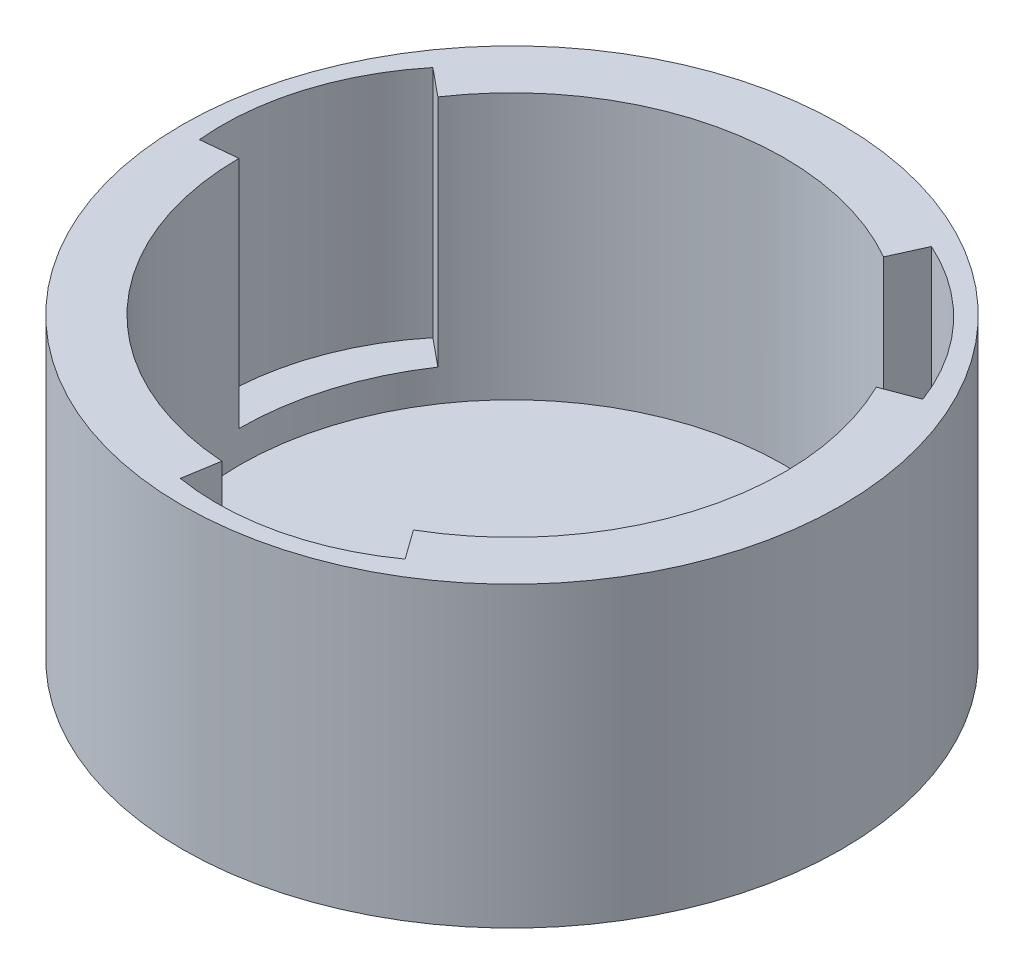
ISO-10303-21;
HEADER;
FILE_DESCRIPTION(('STEP AP214'),'2;1');
FILE_NAME('part.step','',(''),(''),'','','');
FILE_SCHEMA(('AUTOMOTIVE_DESIGN { 1 0 10303 214 1 1 1 1 }'));
ENDSEC;
DATA;
#1=APPLICATION_CONTEXT('core data for automotive mechanical design processes');
#2=APPLICATION_PROTOCOL_DEFINITION('international standard','automotive_design',2000,#1);
#3=PRODUCT_CONTEXT('',#1,'mechanical');
#4=PRODUCT('Part','Part','',(#3));
#5=PRODUCT_RELATED_PRODUCT_CATEGORY('part','',(#4));
#6=PRODUCT_DEFINITION_FORMATION('','',#4);
#7=PRODUCT_DEFINITION_CONTEXT('part definition',#1,'design');
#8=PRODUCT_DEFINITION('design','',#6,#7);
#9=PRODUCT_DEFINITION_SHAPE('','',#8);
#10=(LENGTH_UNIT() NAMED_UNIT(*) SI_UNIT(.MILLI.,.METRE.));
#11=(NAMED_UNIT(*) PLANE_ANGLE_UNIT() SI_UNIT($,.RADIAN.));
#12=(NAMED_UNIT(*) SI_UNIT($,.STERADIAN.) SOLID_ANGLE_UNIT());
#13=UNCERTAINTY_MEASURE_WITH_UNIT(LENGTH_MEASURE(1.E-05),#10,'distance_accuracy_value','');
#14=(GEOMETRIC_REPRESENTATION_CONTEXT(3) GLOBAL_UNCERTAINTY_ASSIGNED_CONTEXT((#13)) GLOBAL_UNIT_ASSIGNED_CONTEXT((#10,
#11,#12)) REPRESENTATION_CONTEXT('',''));
#15=CARTESIAN_POINT('',(0.,0.,0.));
#16=DIRECTION('',(0.,0.,1.));
#17=DIRECTION('',(1.,0.,0.));
#18=AXIS2_PLACEMENT_3D('',#15,#16,#17);
#19=CARTESIAN_POINT('',(0.,28.,0.));
#20=DIRECTION('',(0.,1.,0.));
#21=DIRECTION('',(0.,0.,1.));
#22=AXIS2_PLACEMENT_3D('',#19,#20,#21);
#23=PLANE('',#22);
#24=CARTESIAN_POINT('',(0.,28.,0.));
#25=DIRECTION('',(0.,1.,0.));
#26=DIRECTION('',(0.,0.,1.));
#27=AXIS2_PLACEMENT_3D('',#24,#25,#26);
#28=CIRCLE('',#27,31.);
#29=CARTESIAN_POINT('',(0.,28.,31.));
#30=VERTEX_POINT('',#29);
#31=EDGE_CURVE('E197',#30,#30,#28,.T.);
#32=ORIENTED_EDGE('',*,*,#31,.T.);
#33=EDGE_LOOP('',(#32));
#34=FACE_BOUND('',#33,.T.);
#35=CARTESIAN_POINT('',(0.,28.,0.));
#36=DIRECTION('',(0.,1.,0.));
#37=DIRECTION('',(0.,0.,1.));
#38=AXIS2_PLACEMENT_3D('',#35,#36,#37);
#39=CIRCLE('',#38,25.6);
#40=CARTESIAN_POINT('',(-25.5998841233724,28.,0.0770251251765502));
#41=VERTEX_POINT('',#40);
#42=CARTESIAN_POINT('',(-1.74242408346,28.,25.5406334751779));
#43=VERTEX_POINT('',#42);
#44=EDGE_CURVE('E143',#41,#43,#39,.T.);
#45=ORIENTED_EDGE('',*,*,#44,.F.);
#46=DIRECTION('',(0.99516792454907,0.,-0.0981875855121033));
#47=VECTOR('',#46,1.);
#48=CARTESIAN_POINT('',(-22.0168238197413,28.,-0.276495151431248));
#49=LINE('',#48,#47);
#50=CARTESIAN_POINT('',(-28.9829992915848,28.,0.410817947153475));
#51=VERTEX_POINT('',#50);
#52=EDGE_CURVE('E133',#51,#41,#49,.T.);
#53=ORIENTED_EDGE('',*,*,#52,.F.);
#54=CARTESIAN_POINT('',(-6.09413702695618,28.,-1.8474965196249));
#55=DIRECTION('',(0.,1.,0.));
#56=DIRECTION('',(0.634260880324049,0.,-0.773119095411931));
#57=AXIS2_PLACEMENT_3D('',#54,#55,#56);
#58=CIRCLE('',#57,23.);
#59=CARTESIAN_POINT('',(-23.8758762214306,28.,-16.435496767078));
#60=VERTEX_POINT('',#59);
#61=EDGE_CURVE('E123',#60,#51,#58,.T.);
#62=ORIENTED_EDGE('',*,*,#61,.F.);
#63=DIRECTION('',(-0.773119095411931,0.,-0.634260880324049));
#64=VECTOR('',#63,1.);
#65=CARTESIAN_POINT('',(-18.4640425535471,28.,-11.9956706048097));
#66=LINE('',#65,#64);
#67=CARTESIAN_POINT('',(-21.2476253765212,28.,-14.2793002580312));
#68=VERTEX_POINT('',#67);
#69=EDGE_CURVE('E144',#68,#60,#66,.T.);
#70=ORIENTED_EDGE('',*,*,#69,.F.);
#71=CARTESIAN_POINT('',(12.7332363465534,28.,-22.2086625473668));
#72=VERTEX_POINT('',#71);
#73=EDGE_CURVE('E198',#72,#68,#39,.T.);
#74=ORIENTED_EDGE('',*,*,#73,.F.);
#75=DIRECTION('',(-0.412551018884788,0.,0.910934496446986));
#76=VECTOR('',#75,1.);
#77=CARTESIAN_POINT('',(11.2478637350332,28.,-18.9288811628268));
#78=LINE('',#77,#76);
#79=CARTESIAN_POINT('',(14.1357208672267,28.,-25.3054226379557));
#80=VERTEX_POINT('',#79);
#81=EDGE_CURVE('E156',#80,#72,#78,.T.);
#82=ORIENTED_EDGE('',*,*,#81,.F.);
#83=CARTESIAN_POINT('',(4.64704743287655,28.,-4.35392921967502));
#84=DIRECTION('',(0.,1.,0.));
#85=DIRECTION('',(0.352410336615562,0.,0.93584558269327));
#86=AXIS2_PLACEMENT_3D('',#83,#84,#85);
#87=CIRCLE('',#86,23.);
#88=CARTESIAN_POINT('',(26.1714958348218,28.,-12.4593669618329));
#89=VERTEX_POINT('',#88);
#90=EDGE_CURVE('E154',#89,#80,#87,.T.);
#91=ORIENTED_EDGE('',*,*,#90,.F.);
#92=DIRECTION('',(0.93584558269327,0.,-0.352410336615562));
#93=VECTOR('',#92,1.);
#94=CARTESIAN_POINT('',(19.6205767559689,28.,-9.992494605524));
#95=LINE('',#94,#93);
#96=CARTESIAN_POINT('',(22.9900494599813,28.,-11.2613332171469));
#97=VERTEX_POINT('',#96);
#98=EDGE_CURVE('E159',#97,#89,#95,.T.);
#99=ORIENTED_EDGE('',*,*,#98,.F.);
#100=CARTESIAN_POINT('',(12.8666477768188,28.,22.13163742219));
#101=VERTEX_POINT('',#100);
#102=EDGE_CURVE('E194',#101,#97,#39,.T.);
#103=ORIENTED_EDGE('',*,*,#102,.F.);
#104=DIRECTION('',(-0.582616905664277,0.,-0.812746910934876));
#105=VECTOR('',#104,1.);
#106=CARTESIAN_POINT('',(10.768960084708,28.,19.2053763142579));
#107=LINE('',#106,#105);
#108=CARTESIAN_POINT('',(14.847278424358,28.,24.894604690802));
#109=VERTEX_POINT('',#108);
#110=EDGE_CURVE('E173',#109,#101,#107,.T.);
#111=ORIENTED_EDGE('',*,*,#110,.F.);
#112=CARTESIAN_POINT('',(1.44708959407961,28.,6.20142573929986));
#113=DIRECTION('',(0.,1.,0.));
#114=DIRECTION('',(-0.986671216939603,0.,-0.162726487281338));
#115=AXIS2_PLACEMENT_3D('',#112,#113,#114);
#116=CIRCLE('',#115,23.);
#117=CARTESIAN_POINT('',(-2.29561961339117,28.,28.8948637289107));
#118=VERTEX_POINT('',#117);
#119=EDGE_CURVE('E171',#118,#109,#116,.T.);
#120=ORIENTED_EDGE('',*,*,#119,.F.);
#121=DIRECTION('',(-0.162726487281338,0.,0.986671216939603));
#122=VECTOR('',#121,1.);
#123=CARTESIAN_POINT('',(-1.1565342024218,28.,21.9881652103335));
#124=LINE('',#123,#122);
#125=EDGE_CURVE('E176',#43,#118,#124,.T.);
#126=ORIENTED_EDGE('',*,*,#125,.F.);
#127=EDGE_LOOP('',(#45,#53,#62,#70,#74,#82,#91,#99,#103,#111,#120,#126));
#128=FACE_BOUND('',#127,.T.);
#129=ADVANCED_FACE('F33',(#34,#128),#23,.T.);
#130=CARTESIAN_POINT('',(0.,28.,0.));
#131=DIRECTION('',(0.,-1.,0.));
#132=DIRECTION('',(0.,0.,-1.));
#133=AXIS2_PLACEMENT_3D('',#130,#131,#132);
#134=CYLINDRICAL_SURFACE('',#133,25.6);
#135=CARTESIAN_POINT('',(0.,3.,0.));
#136=DIRECTION('',(0.,1.,0.));
#137=DIRECTION('',(0.,0.,1.));
#138=AXIS2_PLACEMENT_3D('',#135,#136,#137);
#139=CIRCLE('',#138,25.6);
#140=CARTESIAN_POINT('',(0.,3.,25.6));
#141=VERTEX_POINT('',#140);
#142=EDGE_CURVE('E204',#141,#141,#139,.F.);
#143=ORIENTED_EDGE('',*,*,#142,.T.);
#144=EDGE_LOOP('',(#143));
#145=FACE_BOUND('',#144,.T.);
#146=CARTESIAN_POINT('',(0.,6.,0.));
#147=DIRECTION('',(0.,1.,0.));
#148=DIRECTION('',(-1.,0.,0.));
#149=AXIS2_PLACEMENT_3D('',#146,#147,#148);
#150=CIRCLE('',#149,25.6);
#151=CARTESIAN_POINT('',(-21.2476253765212,6.,-14.2793002580312));
#152=VERTEX_POINT('',#151);
#153=CARTESIAN_POINT('',(-25.5998841233724,6.,0.0770251251765493));
#154=VERTEX_POINT('',#153);
#155=EDGE_CURVE('E225',#152,#154,#150,.T.);
#156=ORIENTED_EDGE('',*,*,#155,.T.);
#157=DIRECTION('',(0.,-1.,0.));
#158=VECTOR('',#157,1.);
#159=CARTESIAN_POINT('',(-25.5998841233724,28.,0.0770251251765506));
#160=LINE('',#159,#158);
#161=EDGE_CURVE('E11',#154,#41,#160,.F.);
#162=ORIENTED_EDGE('',*,*,#161,.T.);
#163=ORIENTED_EDGE('',*,*,#44,.T.);
#164=DIRECTION('',(0.,-1.,0.));
#165=VECTOR('',#164,1.);
#166=CARTESIAN_POINT('',(-1.74242408346,28.,25.5406334751779));
#167=LINE('',#166,#165);
#168=CARTESIAN_POINT('',(-1.74242408346,6.,25.5406334751779));
#169=VERTEX_POINT('',#168);
#170=EDGE_CURVE('E210',#43,#169,#167,.T.);
#171=ORIENTED_EDGE('',*,*,#170,.T.);
#172=CARTESIAN_POINT('',(0.,6.,0.));
#173=DIRECTION('',(0.,1.,0.));
#174=DIRECTION('',(-1.,0.,0.));
#175=AXIS2_PLACEMENT_3D('',#172,#173,#174);
#176=CIRCLE('',#175,25.6);
#177=CARTESIAN_POINT('',(12.8666477768188,6.,22.13163742219));
#178=VERTEX_POINT('',#177);
#179=EDGE_CURVE('E207',#169,#178,#176,.T.);
#180=ORIENTED_EDGE('',*,*,#179,.T.);
#181=DIRECTION('',(0.,-1.,0.));
#182=VECTOR('',#181,1.);
#183=CARTESIAN_POINT('',(12.8666477768188,28.,22.13163742219));
#184=LINE('',#183,#182);
#185=EDGE_CURVE('E213',#178,#101,#184,.F.);
#186=ORIENTED_EDGE('',*,*,#185,.T.);
#187=ORIENTED_EDGE('',*,*,#102,.T.);
#188=DIRECTION('',(0.,-1.,0.));
#189=VECTOR('',#188,1.);
#190=CARTESIAN_POINT('',(22.9900494599813,28.,-11.2613332171469));
#191=LINE('',#190,#189);
#192=CARTESIAN_POINT('',(22.9900494599813,6.,-11.2613332171469));
#193=VERTEX_POINT('',#192);
#194=EDGE_CURVE('E219',#97,#193,#191,.T.);
#195=ORIENTED_EDGE('',*,*,#194,.T.);
#196=CARTESIAN_POINT('',(0.,6.,0.));
#197=DIRECTION('',(0.,1.,0.));
#198=DIRECTION('',(0.,0.,1.));
#199=AXIS2_PLACEMENT_3D('',#196,#197,#198);
#200=CIRCLE('',#199,25.6);
#201=CARTESIAN_POINT('',(12.7332363465534,6.,-22.2086625473668));
#202=VERTEX_POINT('',#201);
#203=EDGE_CURVE('E216',#193,#202,#200,.T.);
#204=ORIENTED_EDGE('',*,*,#203,.T.);
#205=DIRECTION('',(0.,-1.,0.));
#206=VECTOR('',#205,1.);
#207=CARTESIAN_POINT('',(12.7332363465534,28.,-22.2086625473668));
#208=LINE('',#207,#206);
#209=EDGE_CURVE('E222',#202,#72,#208,.F.);
#210=ORIENTED_EDGE('',*,*,#209,.T.);
#211=ORIENTED_EDGE('',*,*,#73,.T.);
#212=DIRECTION('',(0.,-1.,0.));
#213=VECTOR('',#212,1.);
#214=CARTESIAN_POINT('',(-21.2476253765212,28.,-14.2793002580312));
#215=LINE('',#214,#213);
#216=EDGE_CURVE('E41',#68,#152,#215,.T.);
#217=ORIENTED_EDGE('',*,*,#216,.T.);
#218=EDGE_LOOP('',(#156,#162,#163,#171,#180,#186,#187,#195,#204,#210,#211,#217));
#219=FACE_BOUND('',#218,.T.);
#220=ADVANCED_FACE('F230',(#145,#219),#134,.F.);
#221=CARTESIAN_POINT('',(0.,3.,0.));
#222=DIRECTION('',(0.,-1.,0.));
#223=DIRECTION('',(0.,0.,-1.));
#224=AXIS2_PLACEMENT_3D('',#221,#222,#223);
#225=CYLINDRICAL_SURFACE('',#224,31.);
#226=CARTESIAN_POINT('',(0.,0.,0.));
#227=DIRECTION('',(0.,1.,0.));
#228=DIRECTION('',(0.,0.,1.));
#229=AXIS2_PLACEMENT_3D('',#226,#227,#228);
#230=CIRCLE('',#229,31.);
#231=CARTESIAN_POINT('',(0.,0.,31.));
#232=VERTEX_POINT('',#231);
#233=EDGE_CURVE('E201',#232,#232,#230,.T.);
#234=ORIENTED_EDGE('',*,*,#233,.T.);
#235=EDGE_LOOP('',(#234));
#236=FACE_BOUND('',#235,.T.);
#237=ORIENTED_EDGE('',*,*,#31,.F.);
#238=EDGE_LOOP('',(#237));
#239=FACE_BOUND('',#238,.T.);
#240=ADVANCED_FACE('F35',(#236,#239),#225,.T.);
#241=CARTESIAN_POINT('',(0.,0.,0.));
#242=DIRECTION('',(0.,1.,0.));
#243=DIRECTION('',(0.,0.,1.));
#244=AXIS2_PLACEMENT_3D('',#241,#242,#243);
#245=PLANE('',#244);
#246=CARTESIAN_POINT('',(0.,0.,0.));
#247=DIRECTION('',(0.,1.,0.));
#248=DIRECTION('',(0.,0.,1.));
#249=AXIS2_PLACEMENT_3D('',#246,#247,#248);
#250=CIRCLE('',#249,9.);
#251=CARTESIAN_POINT('',(0.,0.,9.));
#252=VERTEX_POINT('',#251);
#253=EDGE_CURVE('E189',#252,#252,#250,.T.);
#254=ORIENTED_EDGE('',*,*,#253,.T.);
#255=EDGE_LOOP('',(#254));
#256=FACE_BOUND('',#255,.T.);
#257=ORIENTED_EDGE('',*,*,#233,.F.);
#258=EDGE_LOOP('',(#257));
#259=FACE_BOUND('',#258,.T.);
#260=ADVANCED_FACE('F277',(#256,#259),#245,.F.);
#261=CARTESIAN_POINT('',(0.,3.,0.));
#262=DIRECTION('',(0.,1.,0.));
#263=DIRECTION('',(0.,0.,1.));
#264=AXIS2_PLACEMENT_3D('',#261,#262,#263);
#265=PLANE('',#264);
#266=CARTESIAN_POINT('',(0.,3.,0.));
#267=DIRECTION('',(0.,1.,0.));
#268=DIRECTION('',(0.,0.,1.));
#269=AXIS2_PLACEMENT_3D('',#266,#267,#268);
#270=CIRCLE('',#269,9.);
#271=CARTESIAN_POINT('',(0.,3.,9.));
#272=VERTEX_POINT('',#271);
#273=EDGE_CURVE('E138',#272,#272,#270,.T.);
#274=ORIENTED_EDGE('',*,*,#273,.F.);
#275=EDGE_LOOP('',(#274));
#276=FACE_BOUND('',#275,.T.);
#277=ORIENTED_EDGE('',*,*,#142,.F.);
#278=EDGE_LOOP('',(#277));
#279=FACE_BOUND('',#278,.T.);
#280=ADVANCED_FACE('F274',(#276,#279),#265,.T.);
#281=CARTESIAN_POINT('',(0.,0.,0.));
#282=DIRECTION('',(0.,1.,0.));
#283=DIRECTION('',(0.,0.,1.));
#284=AXIS2_PLACEMENT_3D('',#281,#282,#283);
#285=CYLINDRICAL_SURFACE('',#284,9.);
#286=ORIENTED_EDGE('',*,*,#253,.F.);
#287=EDGE_LOOP('',(#286));
#288=FACE_BOUND('',#287,.T.);
#289=ORIENTED_EDGE('',*,*,#273,.T.);
#290=EDGE_LOOP('',(#289));
#291=FACE_BOUND('',#290,.T.);
#292=ADVANCED_FACE('F276',(#288,#291),#285,.F.);
#293=CARTESIAN_POINT('',(1.44708959407961,28.,6.20142573929986));
#294=DIRECTION('',(0.,-1.,0.));
#295=DIRECTION('',(0.986671216939603,0.,0.162726487281338));
#296=AXIS2_PLACEMENT_3D('',#293,#294,#295);
#297=CYLINDRICAL_SURFACE('',#296,23.);
#298=CARTESIAN_POINT('',(1.44708959407961,6.,6.20142573929986));
#299=DIRECTION('',(0.,1.,0.));
#300=DIRECTION('',(-0.986671216939603,0.,-0.162726487281338));
#301=AXIS2_PLACEMENT_3D('',#298,#299,#300);
#302=CIRCLE('',#301,23.);
#303=CARTESIAN_POINT('',(-2.29561961339117,6.,28.8948637289107));
#304=VERTEX_POINT('',#303);
#305=CARTESIAN_POINT('',(14.847278424358,6.,24.894604690802));
#306=VERTEX_POINT('',#305);
#307=EDGE_CURVE('E179',#304,#306,#302,.T.);
#308=ORIENTED_EDGE('',*,*,#307,.F.);
#309=DIRECTION('',(0.,-1.,0.));
#310=VECTOR('',#309,1.);
#311=CARTESIAN_POINT('',(-2.29561961339117,28.,28.8948637289107));
#312=LINE('',#311,#310);
#313=EDGE_CURVE('E178',#118,#304,#312,.T.);
#314=ORIENTED_EDGE('',*,*,#313,.F.);
#315=ORIENTED_EDGE('',*,*,#119,.T.);
#316=DIRECTION('',(0.,-1.,0.));
#317=VECTOR('',#316,1.);
#318=CARTESIAN_POINT('',(14.847278424358,28.,24.894604690802));
#319=LINE('',#318,#317);
#320=EDGE_CURVE('E164',#109,#306,#319,.T.);
#321=ORIENTED_EDGE('',*,*,#320,.T.);
#322=EDGE_LOOP('',(#308,#314,#315,#321));
#323=FACE_BOUND('',#322,.T.);
#324=ADVANCED_FACE('F247',(#323),#297,.F.);
#325=CARTESIAN_POINT('',(10.768960084708,28.,19.2053763142579));
#326=DIRECTION('',(-0.812746910934876,0.,0.582616905664277));
#327=DIRECTION('',(0.582616905664277,0.,0.812746910934876));
#328=AXIS2_PLACEMENT_3D('',#325,#326,#327);
#329=PLANE('',#328);
#330=DIRECTION('',(-0.582616905664277,0.,-0.812746910934876));
#331=VECTOR('',#330,1.);
#332=CARTESIAN_POINT('',(10.768960084708,6.,19.2053763142579));
#333=LINE('',#332,#331);
#334=EDGE_CURVE('E182',#306,#178,#333,.T.);
#335=ORIENTED_EDGE('',*,*,#334,.F.);
#336=ORIENTED_EDGE('',*,*,#320,.F.);
#337=ORIENTED_EDGE('',*,*,#110,.T.);
#338=ORIENTED_EDGE('',*,*,#185,.F.);
#339=EDGE_LOOP('',(#335,#336,#337,#338));
#340=FACE_BOUND('',#339,.T.);
#341=ADVANCED_FACE('F249',(#340),#329,.T.);
#342=CARTESIAN_POINT('',(-1.1565342024218,28.,21.9881652103335));
#343=DIRECTION('',(0.986671216939603,0.,0.162726487281338));
#344=DIRECTION('',(0.162726487281338,0.,-0.986671216939603));
#345=AXIS2_PLACEMENT_3D('',#342,#343,#344);
#346=PLANE('',#345);
#347=ORIENTED_EDGE('',*,*,#125,.T.);
#348=ORIENTED_EDGE('',*,*,#313,.T.);
#349=DIRECTION('',(-0.162726487281338,0.,0.986671216939603));
#350=VECTOR('',#349,1.);
#351=CARTESIAN_POINT('',(-1.1565342024218,6.,21.9881652103335));
#352=LINE('',#351,#350);
#353=EDGE_CURVE('E174',#169,#304,#352,.T.);
#354=ORIENTED_EDGE('',*,*,#353,.F.);
#355=ORIENTED_EDGE('',*,*,#170,.F.);
#356=EDGE_LOOP('',(#347,#348,#354,#355));
#357=FACE_BOUND('',#356,.T.);
#358=ADVANCED_FACE('F239',(#357),#346,.T.);
#359=CARTESIAN_POINT('',(1.44708959407961,6.,6.20142573929986));
#360=DIRECTION('',(0.,1.,0.));
#361=DIRECTION('',(-0.986671216939603,0.,-0.162726487281338));
#362=AXIS2_PLACEMENT_3D('',#359,#360,#361);
#363=PLANE('',#362);
#364=ORIENTED_EDGE('',*,*,#353,.T.);
#365=ORIENTED_EDGE('',*,*,#307,.T.);
#366=ORIENTED_EDGE('',*,*,#334,.T.);
#367=ORIENTED_EDGE('',*,*,#179,.F.);
#368=EDGE_LOOP('',(#364,#365,#366,#367));
#369=FACE_BOUND('',#368,.T.);
#370=ADVANCED_FACE('F252',(#369),#363,.T.);
#371=CARTESIAN_POINT('',(4.64704743287655,28.,-4.35392921967502));
#372=DIRECTION('',(0.,-1.,0.));
#373=DIRECTION('',(-0.352410336615562,0.,-0.93584558269327));
#374=AXIS2_PLACEMENT_3D('',#371,#372,#373);
#375=CYLINDRICAL_SURFACE('',#374,23.);
#376=CARTESIAN_POINT('',(4.64704743287655,6.,-4.35392921967501));
#377=DIRECTION('',(0.,1.,0.));
#378=DIRECTION('',(0.352410336615562,0.,0.93584558269327));
#379=AXIS2_PLACEMENT_3D('',#376,#377,#378);
#380=CIRCLE('',#379,23.);
#381=CARTESIAN_POINT('',(26.1714958348218,6.,-12.4593669618329));
#382=VERTEX_POINT('',#381);
#383=CARTESIAN_POINT('',(14.1357208672267,6.,-25.3054226379557));
#384=VERTEX_POINT('',#383);
#385=EDGE_CURVE('E162',#382,#384,#380,.T.);
#386=ORIENTED_EDGE('',*,*,#385,.F.);
#387=DIRECTION('',(0.,-1.,0.));
#388=VECTOR('',#387,1.);
#389=CARTESIAN_POINT('',(26.1714958348218,28.,-12.4593669618329));
#390=LINE('',#389,#388);
#391=EDGE_CURVE('E161',#89,#382,#390,.T.);
#392=ORIENTED_EDGE('',*,*,#391,.F.);
#393=ORIENTED_EDGE('',*,*,#90,.T.);
#394=DIRECTION('',(0.,-1.,0.));
#395=VECTOR('',#394,1.);
#396=CARTESIAN_POINT('',(14.1357208672267,28.,-25.3054226379557));
#397=LINE('',#396,#395);
#398=EDGE_CURVE('E150',#80,#384,#397,.T.);
#399=ORIENTED_EDGE('',*,*,#398,.T.);
#400=EDGE_LOOP('',(#386,#392,#393,#399));
#401=FACE_BOUND('',#400,.T.);
#402=ADVANCED_FACE('F254',(#401),#375,.F.);
#403=CARTESIAN_POINT('',(11.2478637350332,28.,-18.9288811628268));
#404=DIRECTION('',(0.910934496446986,0.,0.412551018884788));
#405=DIRECTION('',(0.412551018884788,0.,-0.910934496446986));
#406=AXIS2_PLACEMENT_3D('',#403,#404,#405);
#407=PLANE('',#406);
#408=DIRECTION('',(-0.412551018884788,0.,0.910934496446986));
#409=VECTOR('',#408,1.);
#410=CARTESIAN_POINT('',(11.2478637350332,6.,-18.9288811628268));
#411=LINE('',#410,#409);
#412=EDGE_CURVE('E56',#384,#202,#411,.T.);
#413=ORIENTED_EDGE('',*,*,#412,.F.);
#414=ORIENTED_EDGE('',*,*,#398,.F.);
#415=ORIENTED_EDGE('',*,*,#81,.T.);
#416=ORIENTED_EDGE('',*,*,#209,.F.);
#417=EDGE_LOOP('',(#413,#414,#415,#416));
#418=FACE_BOUND('',#417,.T.);
#419=ADVANCED_FACE('F260',(#418),#407,.T.);
#420=CARTESIAN_POINT('',(19.6205767559689,28.,-9.992494605524));
#421=DIRECTION('',(-0.352410336615562,0.,-0.93584558269327));
#422=DIRECTION('',(-0.93584558269327,0.,0.352410336615562));
#423=AXIS2_PLACEMENT_3D('',#420,#421,#422);
#424=PLANE('',#423);
#425=ORIENTED_EDGE('',*,*,#98,.T.);
#426=ORIENTED_EDGE('',*,*,#391,.T.);
#427=DIRECTION('',(0.93584558269327,0.,-0.352410336615562));
#428=VECTOR('',#427,1.);
#429=CARTESIAN_POINT('',(19.6205767559689,6.,-9.992494605524));
#430=LINE('',#429,#428);
#431=EDGE_CURVE('E157',#193,#382,#430,.T.);
#432=ORIENTED_EDGE('',*,*,#431,.F.);
#433=ORIENTED_EDGE('',*,*,#194,.F.);
#434=EDGE_LOOP('',(#425,#426,#432,#433));
#435=FACE_BOUND('',#434,.T.);
#436=ADVANCED_FACE('F329',(#435),#424,.T.);
#437=CARTESIAN_POINT('',(4.64704743287655,6.,-4.35392921967501));
#438=DIRECTION('',(0.,1.,0.));
#439=DIRECTION('',(0.352410336615562,0.,0.93584558269327));
#440=AXIS2_PLACEMENT_3D('',#437,#438,#439);
#441=PLANE('',#440);
#442=ORIENTED_EDGE('',*,*,#431,.T.);
#443=ORIENTED_EDGE('',*,*,#385,.T.);
#444=ORIENTED_EDGE('',*,*,#412,.T.);
#445=ORIENTED_EDGE('',*,*,#203,.F.);
#446=EDGE_LOOP('',(#442,#443,#444,#445));
#447=FACE_BOUND('',#446,.T.);
#448=ADVANCED_FACE('F339',(#447),#441,.T.);
#449=CARTESIAN_POINT('',(-6.09413702695618,28.,-1.8474965196249));
#450=DIRECTION('',(0.,-1.,0.));
#451=DIRECTION('',(-0.634260880324049,0.,0.773119095411931));
#452=AXIS2_PLACEMENT_3D('',#449,#450,#451);
#453=CYLINDRICAL_SURFACE('',#452,23.);
#454=CARTESIAN_POINT('',(-6.09413702695618,6.,-1.8474965196249));
#455=DIRECTION('',(0.,1.,0.));
#456=DIRECTION('',(0.634260880324049,0.,-0.773119095411931));
#457=AXIS2_PLACEMENT_3D('',#454,#455,#456);
#458=CIRCLE('',#457,23.);
#459=CARTESIAN_POINT('',(-23.8758762214306,6.,-16.435496767078));
#460=VERTEX_POINT('',#459);
#461=CARTESIAN_POINT('',(-28.9829992915848,6.,0.410817947153475));
#462=VERTEX_POINT('',#461);
#463=EDGE_CURVE('E148',#460,#462,#458,.T.);
#464=ORIENTED_EDGE('',*,*,#463,.F.);
#465=DIRECTION('',(0.,-1.,0.));
#466=VECTOR('',#465,1.);
#467=CARTESIAN_POINT('',(-23.8758762214306,28.,-16.435496767078));
#468=LINE('',#467,#466);
#469=EDGE_CURVE('E129',#60,#460,#468,.T.);
#470=ORIENTED_EDGE('',*,*,#469,.F.);
#471=ORIENTED_EDGE('',*,*,#61,.T.);
#472=DIRECTION('',(0.,-1.,0.));
#473=VECTOR('',#472,1.);
#474=CARTESIAN_POINT('',(-28.9829992915848,28.,0.410817947153475));
#475=LINE('',#474,#473);
#476=EDGE_CURVE('E127',#51,#462,#475,.T.);
#477=ORIENTED_EDGE('',*,*,#476,.T.);
#478=EDGE_LOOP('',(#464,#470,#471,#477));
#479=FACE_BOUND('',#478,.T.);
#480=ADVANCED_FACE('F126',(#479),#453,.F.);
#481=CARTESIAN_POINT('',(-22.0168238197413,28.,-0.276495151431248));
#482=DIRECTION('',(-0.0981875855121034,0.,-0.99516792454907));
#483=DIRECTION('',(-0.99516792454907,0.,0.0981875855121034));
#484=AXIS2_PLACEMENT_3D('',#481,#482,#483);
#485=PLANE('',#484);
#486=DIRECTION('',(0.99516792454907,0.,-0.0981875855121033));
#487=VECTOR('',#486,1.);
#488=CARTESIAN_POINT('',(-22.0168238197413,6.,-0.276495151431248));
#489=LINE('',#488,#487);
#490=EDGE_CURVE('E48',#462,#154,#489,.T.);
#491=ORIENTED_EDGE('',*,*,#490,.F.);
#492=ORIENTED_EDGE('',*,*,#476,.F.);
#493=ORIENTED_EDGE('',*,*,#52,.T.);
#494=ORIENTED_EDGE('',*,*,#161,.F.);
#495=EDGE_LOOP('',(#491,#492,#493,#494));
#496=FACE_BOUND('',#495,.T.);
#497=ADVANCED_FACE('F137',(#496),#485,.T.);
#498=CARTESIAN_POINT('',(-18.4640425535471,28.,-11.9956706048097));
#499=DIRECTION('',(-0.634260880324049,0.,0.773119095411931));
#500=DIRECTION('',(0.773119095411931,0.,0.634260880324049));
#501=AXIS2_PLACEMENT_3D('',#498,#499,#500);
#502=PLANE('',#501);
#503=ORIENTED_EDGE('',*,*,#69,.T.);
#504=ORIENTED_EDGE('',*,*,#469,.T.);
#505=DIRECTION('',(-0.773119095411931,0.,-0.634260880324049));
#506=VECTOR('',#505,1.);
#507=CARTESIAN_POINT('',(-18.4640425535471,6.,-11.9956706048097));
#508=LINE('',#507,#506);
#509=EDGE_CURVE('E134',#152,#460,#508,.T.);
#510=ORIENTED_EDGE('',*,*,#509,.F.);
#511=ORIENTED_EDGE('',*,*,#216,.F.);
#512=EDGE_LOOP('',(#503,#504,#510,#511));
#513=FACE_BOUND('',#512,.T.);
#514=ADVANCED_FACE('F234',(#513),#502,.T.);
#515=CARTESIAN_POINT('',(-6.09413702695618,6.,-1.8474965196249));
#516=DIRECTION('',(0.,1.,0.));
#517=DIRECTION('',(0.634260880324049,0.,-0.773119095411931));
#518=AXIS2_PLACEMENT_3D('',#515,#516,#517);
#519=PLANE('',#518);
#520=ORIENTED_EDGE('',*,*,#509,.T.);
#521=ORIENTED_EDGE('',*,*,#463,.T.);
#522=ORIENTED_EDGE('',*,*,#490,.T.);
#523=ORIENTED_EDGE('',*,*,#155,.F.);
#524=EDGE_LOOP('',(#520,#521,#522,#523));
#525=FACE_BOUND('',#524,.T.);
#526=ADVANCED_FACE('F373',(#525),#519,.T.);
#527=CLOSED_SHELL('',(#129,#220,#240,#260,#280,#292,#324,#341,#358,#370,#402,#419,#436,#448,
#480,#497,#514,#526));
#528=MANIFOLD_SOLID_BREP('B2',#527);
#529=ADVANCED_BREP_SHAPE_REPRESENTATION('',(#18,#528),#14);
#530=SHAPE_DEFINITION_REPRESENTATION(#9,#529);
ENDSEC;
END-ISO-10303-21;
